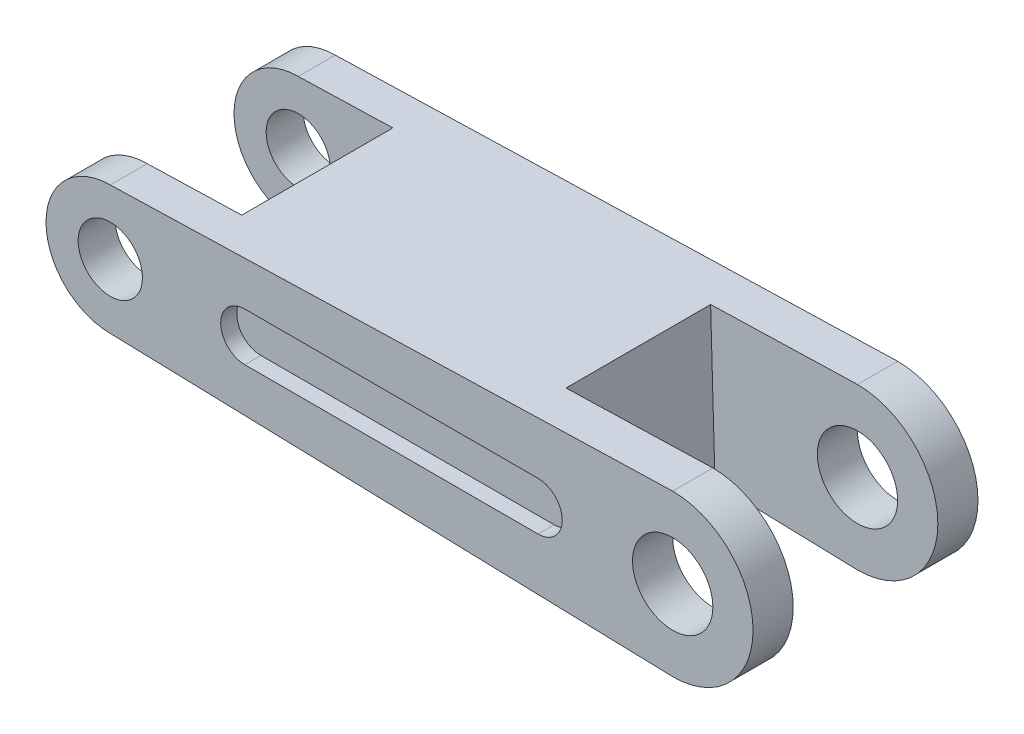
ISO-10303-21;
HEADER;
FILE_DESCRIPTION(('STEP AP214'),'2;1');
FILE_NAME('part.step','',(''),(''),'','','');
FILE_SCHEMA(('AUTOMOTIVE_DESIGN { 1 0 10303 214 1 1 1 1 }'));
ENDSEC;
DATA;
#1=APPLICATION_CONTEXT('core data for automotive mechanical design processes');
#2=APPLICATION_PROTOCOL_DEFINITION('international standard','automotive_design',2000,#1);
#3=PRODUCT_CONTEXT('',#1,'mechanical');
#4=PRODUCT('Part','Part','',(#3));
#5=PRODUCT_RELATED_PRODUCT_CATEGORY('part','',(#4));
#6=PRODUCT_DEFINITION_FORMATION('','',#4);
#7=PRODUCT_DEFINITION_CONTEXT('part definition',#1,'design');
#8=PRODUCT_DEFINITION('design','',#6,#7);
#9=PRODUCT_DEFINITION_SHAPE('','',#8);
#10=(LENGTH_UNIT() NAMED_UNIT(*) SI_UNIT(.MILLI.,.METRE.));
#11=(NAMED_UNIT(*) PLANE_ANGLE_UNIT() SI_UNIT($,.RADIAN.));
#12=(NAMED_UNIT(*) SI_UNIT($,.STERADIAN.) SOLID_ANGLE_UNIT());
#13=UNCERTAINTY_MEASURE_WITH_UNIT(LENGTH_MEASURE(1.E-05),#10,'distance_accuracy_value','');
#14=(GEOMETRIC_REPRESENTATION_CONTEXT(3) GLOBAL_UNCERTAINTY_ASSIGNED_CONTEXT((#13)) GLOBAL_UNIT_ASSIGNED_CONTEXT((#10,
#11,#12)) REPRESENTATION_CONTEXT('',''));
#15=CARTESIAN_POINT('',(0.,0.,0.));
#16=DIRECTION('',(0.,0.,1.));
#17=DIRECTION('',(1.,0.,0.));
#18=AXIS2_PLACEMENT_3D('',#15,#16,#17);
#19=CARTESIAN_POINT('',(0.,0.,-70.));
#20=DIRECTION('',(0.,0.,1.));
#21=DIRECTION('',(1.,0.,0.));
#22=AXIS2_PLACEMENT_3D('',#19,#20,#21);
#23=PLANE('',#22);
#24=DIRECTION('',(0.999592086460695,-0.0285597738988768,0.));
#25=VECTOR('',#24,1.);
#26=CARTESIAN_POINT('',(-1.28466557911907,-44.963295269168,-70.));
#27=LINE('',#26,#25);
#28=CARTESIAN_POINT('',(-175.,-40.,-70.));
#29=VERTEX_POINT('',#28);
#30=CARTESIAN_POINT('',(175.,-49.9999999999999,-70.));
#31=VERTEX_POINT('',#30);
#32=EDGE_CURVE('E384',#29,#31,#27,.T.);
#33=ORIENTED_EDGE('',*,*,#32,.F.);
#34=CARTESIAN_POINT('',(-175.,0.,-70.));
#35=DIRECTION('',(0.,0.,1.));
#36=DIRECTION('',(1.,0.,0.));
#37=AXIS2_PLACEMENT_3D('',#34,#35,#36);
#38=CIRCLE('',#37,40.);
#39=CARTESIAN_POINT('',(-175.,40.,-70.));
#40=VERTEX_POINT('',#39);
#41=EDGE_CURVE('E358',#40,#29,#38,.T.);
#42=ORIENTED_EDGE('',*,*,#41,.F.);
#43=DIRECTION('',(0.999592086460695,0.0285597738988771,0.));
#44=VECTOR('',#43,1.);
#45=CARTESIAN_POINT('',(-1.28466557911909,44.963295269168,-70.));
#46=LINE('',#45,#44);
#47=CARTESIAN_POINT('',(175.,50.,-70.));
#48=VERTEX_POINT('',#47);
#49=EDGE_CURVE('E392',#40,#48,#46,.T.);
#50=ORIENTED_EDGE('',*,*,#49,.T.);
#51=CARTESIAN_POINT('',(175.,0.,-70.));
#52=DIRECTION('',(0.,0.,1.));
#53=DIRECTION('',(1.,0.,0.));
#54=AXIS2_PLACEMENT_3D('',#51,#52,#53);
#55=CIRCLE('',#54,50.);
#56=EDGE_CURVE('E388',#31,#48,#55,.T.);
#57=ORIENTED_EDGE('',*,*,#56,.F.);
#58=EDGE_LOOP('',(#33,#42,#50,#57));
#59=FACE_BOUND('',#58,.T.);
#60=CARTESIAN_POINT('',(-175.,0.,-70.));
#61=DIRECTION('',(0.,0.,1.));
#62=DIRECTION('',(1.,0.,0.));
#63=AXIS2_PLACEMENT_3D('',#60,#61,#62);
#64=CIRCLE('',#63,20.);
#65=CARTESIAN_POINT('',(-155.,0.,-70.));
#66=VERTEX_POINT('',#65);
#67=EDGE_CURVE('E380',#66,#66,#64,.T.);
#68=ORIENTED_EDGE('',*,*,#67,.T.);
#69=EDGE_LOOP('',(#68));
#70=FACE_BOUND('',#69,.T.);
#71=CARTESIAN_POINT('',(175.,0.,-70.));
#72=DIRECTION('',(0.,0.,1.));
#73=DIRECTION('',(1.,0.,0.));
#74=AXIS2_PLACEMENT_3D('',#71,#72,#73);
#75=CIRCLE('',#74,25.);
#76=CARTESIAN_POINT('',(200.,0.,-70.));
#77=VERTEX_POINT('',#76);
#78=EDGE_CURVE('E352',#77,#77,#75,.T.);
#79=ORIENTED_EDGE('',*,*,#78,.T.);
#80=EDGE_LOOP('',(#79));
#81=FACE_BOUND('',#80,.T.);
#82=CARTESIAN_POINT('',(-91.28113722148,0.,-70.));
#83=DIRECTION('',(0.,0.,1.));
#84=DIRECTION('',(1.,0.,0.));
#85=AXIS2_PLACEMENT_3D('',#82,#83,#84);
#86=CIRCLE('',#85,15.);
#87=CARTESIAN_POINT('',(-91.28113722148,15.,-70.));
#88=VERTEX_POINT('',#87);
#89=CARTESIAN_POINT('',(-91.28113722148,-15.,-70.));
#90=VERTEX_POINT('',#89);
#91=EDGE_CURVE('E63',#88,#90,#86,.T.);
#92=ORIENTED_EDGE('',*,*,#91,.T.);
#93=DIRECTION('',(1.,0.,0.));
#94=VECTOR('',#93,1.);
#95=CARTESIAN_POINT('',(-91.28113722148,-15.,-70.));
#96=LINE('',#95,#94);
#97=CARTESIAN_POINT('',(91.28113722148,-15.,-70.));
#98=VERTEX_POINT('',#97);
#99=EDGE_CURVE('E207',#90,#98,#96,.T.);
#100=ORIENTED_EDGE('',*,*,#99,.T.);
#101=CARTESIAN_POINT('',(91.28113722148,0.,-70.));
#102=DIRECTION('',(0.,0.,1.));
#103=DIRECTION('',(1.,0.,0.));
#104=AXIS2_PLACEMENT_3D('',#101,#102,#103);
#105=CIRCLE('',#104,15.);
#106=CARTESIAN_POINT('',(91.28113722148,15.,-70.));
#107=VERTEX_POINT('',#106);
#108=EDGE_CURVE('E211',#98,#107,#105,.T.);
#109=ORIENTED_EDGE('',*,*,#108,.T.);
#110=DIRECTION('',(-1.,0.,0.));
#111=VECTOR('',#110,1.);
#112=CARTESIAN_POINT('',(-91.28113722148,15.,-70.));
#113=LINE('',#112,#111);
#114=EDGE_CURVE('E220',#107,#88,#113,.T.);
#115=ORIENTED_EDGE('',*,*,#114,.T.);
#116=EDGE_LOOP('',(#92,#100,#109,#115));
#117=FACE_BOUND('',#116,.T.);
#118=ADVANCED_FACE('F45',(#59,#70,#81,#117),#23,.F.);
#119=CARTESIAN_POINT('',(-175.,0.,70.));
#120=DIRECTION('',(0.,0.,-1.));
#121=DIRECTION('',(-1.,0.,0.));
#122=AXIS2_PLACEMENT_3D('',#119,#120,#121);
#123=CYLINDRICAL_SURFACE('',#122,40.);
#124=DIRECTION('',(0.,0.,-1.));
#125=VECTOR('',#124,1.);
#126=CARTESIAN_POINT('',(-175.,40.,70.));
#127=LINE('',#126,#125);
#128=CARTESIAN_POINT('',(-175.,40.,70.));
#129=VERTEX_POINT('',#128);
#130=CARTESIAN_POINT('',(-175.000000000001,40.,47.));
#131=VERTEX_POINT('',#130);
#132=EDGE_CURVE('E404',#129,#131,#127,.T.);
#133=ORIENTED_EDGE('',*,*,#132,.T.);
#134=CARTESIAN_POINT('',(-175.,0.,47.));
#135=DIRECTION('',(0.,0.,1.));
#136=DIRECTION('',(1.,0.,0.));
#137=AXIS2_PLACEMENT_3D('',#134,#135,#136);
#138=CIRCLE('',#137,40.);
#139=CARTESIAN_POINT('',(-175.,-40.,47.));
#140=VERTEX_POINT('',#139);
#141=EDGE_CURVE('E11',#131,#140,#138,.T.);
#142=ORIENTED_EDGE('',*,*,#141,.T.);
#143=DIRECTION('',(0.,0.,-1.));
#144=VECTOR('',#143,1.);
#145=CARTESIAN_POINT('',(-175.,-40.,70.));
#146=LINE('',#145,#144);
#147=CARTESIAN_POINT('',(-175.,-40.,70.));
#148=VERTEX_POINT('',#147);
#149=EDGE_CURVE('E399',#148,#140,#146,.T.);
#150=ORIENTED_EDGE('',*,*,#149,.F.);
#151=CARTESIAN_POINT('',(-175.,0.,70.));
#152=DIRECTION('',(0.,0.,1.));
#153=DIRECTION('',(1.,0.,0.));
#154=AXIS2_PLACEMENT_3D('',#151,#152,#153);
#155=CIRCLE('',#154,40.);
#156=EDGE_CURVE('E373',#129,#148,#155,.T.);
#157=ORIENTED_EDGE('',*,*,#156,.F.);
#158=EDGE_LOOP('',(#133,#142,#150,#157));
#159=FACE_BOUND('',#158,.T.);
#160=ADVANCED_FACE('F457',(#159),#123,.T.);
#161=CARTESIAN_POINT('',(175.,0.,70.));
#162=DIRECTION('',(0.,0.,-1.));
#163=DIRECTION('',(-1.,0.,0.));
#164=AXIS2_PLACEMENT_3D('',#161,#162,#163);
#165=CYLINDRICAL_SURFACE('',#164,50.);
#166=DIRECTION('',(0.,0.,-1.));
#167=VECTOR('',#166,1.);
#168=CARTESIAN_POINT('',(175.,50.,70.));
#169=LINE('',#168,#167);
#170=CARTESIAN_POINT('',(175.,50.,-45.));
#171=VERTEX_POINT('',#170);
#172=EDGE_CURVE('E408',#171,#48,#169,.T.);
#173=ORIENTED_EDGE('',*,*,#172,.F.);
#174=CARTESIAN_POINT('',(175.,0.,-45.));
#175=DIRECTION('',(0.,0.,-1.));
#176=DIRECTION('',(-1.,0.,0.));
#177=AXIS2_PLACEMENT_3D('',#174,#175,#176);
#178=CIRCLE('',#177,50.);
#179=CARTESIAN_POINT('',(175.,-49.9999999999999,-45.));
#180=VERTEX_POINT('',#179);
#181=EDGE_CURVE('E336',#171,#180,#178,.T.);
#182=ORIENTED_EDGE('',*,*,#181,.T.);
#183=DIRECTION('',(0.,0.,-1.));
#184=VECTOR('',#183,1.);
#185=CARTESIAN_POINT('',(175.,-49.9999999999999,70.));
#186=LINE('',#185,#184);
#187=EDGE_CURVE('E413',#180,#31,#186,.T.);
#188=ORIENTED_EDGE('',*,*,#187,.T.);
#189=ORIENTED_EDGE('',*,*,#56,.T.);
#190=EDGE_LOOP('',(#173,#182,#188,#189));
#191=FACE_BOUND('',#190,.T.);
#192=ADVANCED_FACE('F549',(#191),#165,.T.);
#193=CARTESIAN_POINT('',(-175.,0.,70.));
#194=DIRECTION('',(0.,0.,-1.));
#195=DIRECTION('',(-1.,0.,0.));
#196=AXIS2_PLACEMENT_3D('',#193,#194,#195);
#197=CYLINDRICAL_SURFACE('',#196,20.);
#198=CARTESIAN_POINT('',(-175.,0.,47.));
#199=DIRECTION('',(0.,0.,1.));
#200=DIRECTION('',(1.,0.,0.));
#201=AXIS2_PLACEMENT_3D('',#198,#199,#200);
#202=CIRCLE('',#201,20.);
#203=CARTESIAN_POINT('',(-155.,0.,47.));
#204=VERTEX_POINT('',#203);
#205=EDGE_CURVE('E324',#204,#204,#202,.T.);
#206=ORIENTED_EDGE('',*,*,#205,.F.);
#207=EDGE_LOOP('',(#206));
#208=FACE_BOUND('',#207,.T.);
#209=CARTESIAN_POINT('',(-175.,0.,70.));
#210=DIRECTION('',(0.,0.,1.));
#211=DIRECTION('',(1.,0.,0.));
#212=AXIS2_PLACEMENT_3D('',#209,#210,#211);
#213=CIRCLE('',#212,20.);
#214=CARTESIAN_POINT('',(-155.,0.,70.));
#215=VERTEX_POINT('',#214);
#216=EDGE_CURVE('E357',#215,#215,#213,.T.);
#217=ORIENTED_EDGE('',*,*,#216,.T.);
#218=EDGE_LOOP('',(#217));
#219=FACE_BOUND('',#218,.T.);
#220=ADVANCED_FACE('F484',(#208,#219),#197,.F.);
#221=CARTESIAN_POINT('',(175.,0.,70.));
#222=DIRECTION('',(0.,0.,-1.));
#223=DIRECTION('',(-1.,0.,0.));
#224=AXIS2_PLACEMENT_3D('',#221,#222,#223);
#225=CYLINDRICAL_SURFACE('',#224,25.);
#226=CARTESIAN_POINT('',(175.,0.,-45.));
#227=DIRECTION('',(0.,0.,-1.));
#228=DIRECTION('',(-1.,0.,0.));
#229=AXIS2_PLACEMENT_3D('',#226,#227,#228);
#230=CIRCLE('',#229,25.);
#231=CARTESIAN_POINT('',(150.,0.,-45.));
#232=VERTEX_POINT('',#231);
#233=EDGE_CURVE('E49',#232,#232,#230,.T.);
#234=ORIENTED_EDGE('',*,*,#233,.F.);
#235=EDGE_LOOP('',(#234));
#236=FACE_BOUND('',#235,.T.);
#237=ORIENTED_EDGE('',*,*,#78,.F.);
#238=EDGE_LOOP('',(#237));
#239=FACE_BOUND('',#238,.T.);
#240=ADVANCED_FACE('F430',(#236,#239),#225,.F.);
#241=CARTESIAN_POINT('',(-1.28466557911907,-44.963295269168,70.));
#242=DIRECTION('',(0.0285597738988768,0.999592086460695,0.));
#243=DIRECTION('',(-0.999592086460695,0.0285597738988768,0.));
#244=AXIS2_PLACEMENT_3D('',#241,#242,#243);
#245=PLANE('',#244);
#246=ORIENTED_EDGE('',*,*,#149,.T.);
#247=DIRECTION('',(0.999592086460695,-0.0285597738988768,0.));
#248=VECTOR('',#247,1.);
#249=CARTESIAN_POINT('',(-1.28466557911908,-44.963295269168,47.));
#250=LINE('',#249,#248);
#251=CARTESIAN_POINT('',(-113.782684738522,-41.7490661503279,47.));
#252=VERTEX_POINT('',#251);
#253=EDGE_CURVE('E320',#140,#252,#250,.T.);
#254=ORIENTED_EDGE('',*,*,#253,.T.);
#255=DIRECTION('',(0.,0.,-1.));
#256=VECTOR('',#255,1.);
#257=CARTESIAN_POINT('',(-113.782684738522,-41.7490661503279,70.));
#258=LINE('',#257,#256);
#259=CARTESIAN_POINT('',(-113.782684738522,-41.7490661503279,-47.0000000000001));
#260=VERTEX_POINT('',#259);
#261=EDGE_CURVE('E348',#252,#260,#258,.T.);
#262=ORIENTED_EDGE('',*,*,#261,.T.);
#263=DIRECTION('',(-0.999592086460695,0.0285597738988768,0.));
#264=VECTOR('',#263,1.);
#265=CARTESIAN_POINT('',(-1.28466557911909,-44.963295269168,-47.0000000000001));
#266=LINE('',#265,#264);
#267=CARTESIAN_POINT('',(-175.,-40.,-47.0000000000001));
#268=VERTEX_POINT('',#267);
#269=EDGE_CURVE('E294',#260,#268,#266,.T.);
#270=ORIENTED_EDGE('',*,*,#269,.T.);
#271=EDGE_CURVE('E376',#268,#29,#146,.T.);
#272=ORIENTED_EDGE('',*,*,#271,.T.);
#273=ORIENTED_EDGE('',*,*,#32,.T.);
#274=ORIENTED_EDGE('',*,*,#187,.F.);
#275=DIRECTION('',(-0.999592086460695,0.0285597738988768,0.));
#276=VECTOR('',#275,1.);
#277=CARTESIAN_POINT('',(-1.28466557911908,-44.963295269168,-45.));
#278=LINE('',#277,#276);
#279=CARTESIAN_POINT('',(86.3194519443847,-47.4662700555538,-45.));
#280=VERTEX_POINT('',#279);
#281=EDGE_CURVE('E340',#180,#280,#278,.T.);
#282=ORIENTED_EDGE('',*,*,#281,.T.);
#283=DIRECTION('',(0.,0.,1.));
#284=VECTOR('',#283,1.);
#285=CARTESIAN_POINT('',(86.3194519443847,-47.4662700555538,70.));
#286=LINE('',#285,#284);
#287=CARTESIAN_POINT('',(86.3194519443847,-47.4662700555538,45.));
#288=VERTEX_POINT('',#287);
#289=EDGE_CURVE('E344',#280,#288,#286,.T.);
#290=ORIENTED_EDGE('',*,*,#289,.T.);
#291=DIRECTION('',(0.999592086460695,-0.0285597738988768,0.));
#292=VECTOR('',#291,1.);
#293=CARTESIAN_POINT('',(-1.28466557911907,-44.963295269168,45.));
#294=LINE('',#293,#292);
#295=CARTESIAN_POINT('',(175.,-49.9999999999999,45.));
#296=VERTEX_POINT('',#295);
#297=EDGE_CURVE('E332',#288,#296,#294,.T.);
#298=ORIENTED_EDGE('',*,*,#297,.T.);
#299=CARTESIAN_POINT('',(175.,-49.9999999999999,70.));
#300=VERTEX_POINT('',#299);
#301=EDGE_CURVE('E414',#300,#296,#186,.T.);
#302=ORIENTED_EDGE('',*,*,#301,.F.);
#303=DIRECTION('',(0.999592086460695,-0.0285597738988768,0.));
#304=VECTOR('',#303,1.);
#305=CARTESIAN_POINT('',(-1.28466557911907,-44.963295269168,70.));
#306=LINE('',#305,#304);
#307=EDGE_CURVE('E362',#148,#300,#306,.T.);
#308=ORIENTED_EDGE('',*,*,#307,.F.);
#309=EDGE_LOOP('',(#246,#254,#262,#270,#272,#273,#274,#282,#290,#298,#302,#308));
#310=FACE_BOUND('',#309,.T.);
#311=ADVANCED_FACE('F448',(#310),#245,.F.);
#312=CARTESIAN_POINT('',(175.,0.,45.));
#313=DIRECTION('',(0.,0.,1.));
#314=DIRECTION('',(1.,0.,0.));
#315=AXIS2_PLACEMENT_3D('',#312,#313,#314);
#316=CIRCLE('',#315,50.);
#317=CARTESIAN_POINT('',(175.,50.,45.));
#318=VERTEX_POINT('',#317);
#319=EDGE_CURVE('E329',#296,#318,#316,.T.);
#320=ORIENTED_EDGE('',*,*,#319,.T.);
#321=CARTESIAN_POINT('',(175.,50.,70.));
#322=VERTEX_POINT('',#321);
#323=EDGE_CURVE('E409',#322,#318,#169,.T.);
#324=ORIENTED_EDGE('',*,*,#323,.F.);
#325=CARTESIAN_POINT('',(175.,0.,70.));
#326=DIRECTION('',(0.,0.,1.));
#327=DIRECTION('',(1.,0.,0.));
#328=AXIS2_PLACEMENT_3D('',#325,#326,#327);
#329=CIRCLE('',#328,50.);
#330=EDGE_CURVE('E366',#300,#322,#329,.T.);
#331=ORIENTED_EDGE('',*,*,#330,.F.);
#332=ORIENTED_EDGE('',*,*,#301,.T.);
#333=EDGE_LOOP('',(#320,#324,#331,#332));
#334=FACE_BOUND('',#333,.T.);
#335=ADVANCED_FACE('F450',(#334),#165,.T.);
#336=CARTESIAN_POINT('',(-1.28466557911909,44.963295269168,70.));
#337=DIRECTION('',(-0.0285597738988771,0.999592086460695,0.));
#338=DIRECTION('',(-0.999592086460695,-0.0285597738988771,0.));
#339=AXIS2_PLACEMENT_3D('',#336,#337,#338);
#340=PLANE('',#339);
#341=DIRECTION('',(0.999592086460695,0.0285597738988771,0.));
#342=VECTOR('',#341,1.);
#343=CARTESIAN_POINT('',(-116.166399771575,41.6809600065264,47.));
#344=LINE('',#343,#342);
#345=CARTESIAN_POINT('',(-116.166399771575,41.6809600065264,47.));
#346=VERTEX_POINT('',#345);
#347=EDGE_CURVE('E286',#131,#346,#344,.T.);
#348=ORIENTED_EDGE('',*,*,#347,.F.);
#349=ORIENTED_EDGE('',*,*,#132,.F.);
#350=DIRECTION('',(0.999592086460695,0.0285597738988771,0.));
#351=VECTOR('',#350,1.);
#352=CARTESIAN_POINT('',(-1.28466557911909,44.963295269168,70.));
#353=LINE('',#352,#351);
#354=EDGE_CURVE('E369',#129,#322,#353,.T.);
#355=ORIENTED_EDGE('',*,*,#354,.T.);
#356=ORIENTED_EDGE('',*,*,#323,.T.);
#357=DIRECTION('',(0.999592086460695,0.0285597738988771,0.));
#358=VECTOR('',#357,1.);
#359=CARTESIAN_POINT('',(83.6093060195162,47.3888373148434,45.));
#360=LINE('',#359,#358);
#361=CARTESIAN_POINT('',(83.6093060195162,47.3888373148434,45.));
#362=VERTEX_POINT('',#361);
#363=EDGE_CURVE('E307',#362,#318,#360,.T.);
#364=ORIENTED_EDGE('',*,*,#363,.F.);
#365=DIRECTION('',(0.,0.,1.));
#366=VECTOR('',#365,1.);
#367=CARTESIAN_POINT('',(83.6093060195162,47.3888373148434,-45.));
#368=LINE('',#367,#366);
#369=CARTESIAN_POINT('',(83.6093060195162,47.3888373148434,-45.));
#370=VERTEX_POINT('',#369);
#371=EDGE_CURVE('E282',#370,#362,#368,.T.);
#372=ORIENTED_EDGE('',*,*,#371,.F.);
#373=DIRECTION('',(-0.999592086460695,-0.0285597738988771,0.));
#374=VECTOR('',#373,1.);
#375=CARTESIAN_POINT('',(83.6093060195162,47.3888373148434,-45.));
#376=LINE('',#375,#374);
#377=EDGE_CURVE('E301',#171,#370,#376,.T.);
#378=ORIENTED_EDGE('',*,*,#377,.F.);
#379=ORIENTED_EDGE('',*,*,#172,.T.);
#380=ORIENTED_EDGE('',*,*,#49,.F.);
#381=CARTESIAN_POINT('',(-175.,40.,-47.0000000000001));
#382=VERTEX_POINT('',#381);
#383=EDGE_CURVE('E403',#382,#40,#127,.T.);
#384=ORIENTED_EDGE('',*,*,#383,.F.);
#385=DIRECTION('',(-0.999592086460695,-0.0285597738988771,0.));
#386=VECTOR('',#385,1.);
#387=CARTESIAN_POINT('',(-116.166399771575,41.6809600065264,-47.0000000000001));
#388=LINE('',#387,#386);
#389=CARTESIAN_POINT('',(-116.166399771575,41.6809600065264,-47.0000000000001));
#390=VERTEX_POINT('',#389);
#391=EDGE_CURVE('E281',#390,#382,#388,.T.);
#392=ORIENTED_EDGE('',*,*,#391,.F.);
#393=DIRECTION('',(0.,0.,-1.));
#394=VECTOR('',#393,1.);
#395=CARTESIAN_POINT('',(-116.166399771575,41.6809600065264,-47.0000000000001));
#396=LINE('',#395,#394);
#397=EDGE_CURVE('E277',#346,#390,#396,.T.);
#398=ORIENTED_EDGE('',*,*,#397,.F.);
#399=EDGE_LOOP('',(#348,#349,#355,#356,#364,#372,#378,#379,#380,#384,#392,#398));
#400=FACE_BOUND('',#399,.T.);
#401=ADVANCED_FACE('F454',(#400),#340,.T.);
#402=CARTESIAN_POINT('',(-175.,0.,-47.0000000000001));
#403=DIRECTION('',(0.,0.,-1.));
#404=DIRECTION('',(-1.,0.,0.));
#405=AXIS2_PLACEMENT_3D('',#402,#403,#404);
#406=CIRCLE('',#405,20.);
#407=CARTESIAN_POINT('',(-195.,0.,-47.0000000000001));
#408=VERTEX_POINT('',#407);
#409=EDGE_CURVE('E316',#408,#408,#406,.T.);
#410=ORIENTED_EDGE('',*,*,#409,.F.);
#411=EDGE_LOOP('',(#410));
#412=FACE_BOUND('',#411,.T.);
#413=ORIENTED_EDGE('',*,*,#67,.F.);
#414=EDGE_LOOP('',(#413));
#415=FACE_BOUND('',#414,.T.);
#416=ADVANCED_FACE('F429',(#412,#415),#197,.F.);
#417=CARTESIAN_POINT('',(175.,0.,45.));
#418=DIRECTION('',(0.,0.,1.));
#419=DIRECTION('',(1.,0.,0.));
#420=AXIS2_PLACEMENT_3D('',#417,#418,#419);
#421=CIRCLE('',#420,25.);
#422=CARTESIAN_POINT('',(200.,0.,45.));
#423=VERTEX_POINT('',#422);
#424=EDGE_CURVE('E328',#423,#423,#421,.T.);
#425=ORIENTED_EDGE('',*,*,#424,.F.);
#426=EDGE_LOOP('',(#425));
#427=FACE_BOUND('',#426,.T.);
#428=CARTESIAN_POINT('',(175.,0.,70.));
#429=DIRECTION('',(0.,0.,1.));
#430=DIRECTION('',(1.,0.,0.));
#431=AXIS2_PLACEMENT_3D('',#428,#429,#430);
#432=CIRCLE('',#431,25.);
#433=CARTESIAN_POINT('',(200.,0.,70.));
#434=VERTEX_POINT('',#433);
#435=EDGE_CURVE('E353',#434,#434,#432,.T.);
#436=ORIENTED_EDGE('',*,*,#435,.T.);
#437=EDGE_LOOP('',(#436));
#438=FACE_BOUND('',#437,.T.);
#439=ADVANCED_FACE('F47',(#427,#438),#225,.F.);
#440=CARTESIAN_POINT('',(-175.,0.,-47.0000000000001));
#441=DIRECTION('',(0.,0.,-1.));
#442=DIRECTION('',(-1.,0.,0.));
#443=AXIS2_PLACEMENT_3D('',#440,#441,#442);
#444=CIRCLE('',#443,40.);
#445=EDGE_CURVE('E55',#268,#382,#444,.T.);
#446=ORIENTED_EDGE('',*,*,#445,.T.);
#447=ORIENTED_EDGE('',*,*,#383,.T.);
#448=ORIENTED_EDGE('',*,*,#41,.T.);
#449=ORIENTED_EDGE('',*,*,#271,.F.);
#450=EDGE_LOOP('',(#446,#447,#448,#449));
#451=FACE_BOUND('',#450,.T.);
#452=ADVANCED_FACE('F428',(#451),#123,.T.);
#453=CARTESIAN_POINT('',(0.,0.,70.));
#454=DIRECTION('',(0.,0.,1.));
#455=DIRECTION('',(1.,0.,0.));
#456=AXIS2_PLACEMENT_3D('',#453,#454,#455);
#457=PLANE('',#456);
#458=CARTESIAN_POINT('',(-91.28113722148,0.,70.));
#459=DIRECTION('',(0.,0.,1.));
#460=DIRECTION('',(1.,0.,0.));
#461=AXIS2_PLACEMENT_3D('',#458,#459,#460);
#462=CIRCLE('',#461,15.);
#463=CARTESIAN_POINT('',(-91.28113722148,15.,70.));
#464=VERTEX_POINT('',#463);
#465=CARTESIAN_POINT('',(-91.28113722148,-15.,70.));
#466=VERTEX_POINT('',#465);
#467=EDGE_CURVE('E71',#464,#466,#462,.T.);
#468=ORIENTED_EDGE('',*,*,#467,.F.);
#469=DIRECTION('',(-1.,0.,0.));
#470=VECTOR('',#469,1.);
#471=CARTESIAN_POINT('',(-91.28113722148,15.,70.));
#472=LINE('',#471,#470);
#473=CARTESIAN_POINT('',(91.28113722148,15.,70.));
#474=VERTEX_POINT('',#473);
#475=EDGE_CURVE('E239',#474,#464,#472,.T.);
#476=ORIENTED_EDGE('',*,*,#475,.F.);
#477=CARTESIAN_POINT('',(91.28113722148,0.,70.));
#478=DIRECTION('',(0.,0.,1.));
#479=DIRECTION('',(1.,0.,0.));
#480=AXIS2_PLACEMENT_3D('',#477,#478,#479);
#481=CIRCLE('',#480,15.);
#482=CARTESIAN_POINT('',(91.28113722148,-15.,70.));
#483=VERTEX_POINT('',#482);
#484=EDGE_CURVE('E258',#483,#474,#481,.T.);
#485=ORIENTED_EDGE('',*,*,#484,.F.);
#486=DIRECTION('',(1.,0.,0.));
#487=VECTOR('',#486,1.);
#488=CARTESIAN_POINT('',(-91.28113722148,-15.,70.));
#489=LINE('',#488,#487);
#490=EDGE_CURVE('E254',#466,#483,#489,.T.);
#491=ORIENTED_EDGE('',*,*,#490,.F.);
#492=EDGE_LOOP('',(#468,#476,#485,#491));
#493=FACE_BOUND('',#492,.T.);
#494=ORIENTED_EDGE('',*,*,#435,.F.);
#495=EDGE_LOOP('',(#494));
#496=FACE_BOUND('',#495,.T.);
#497=ORIENTED_EDGE('',*,*,#216,.F.);
#498=EDGE_LOOP('',(#497));
#499=FACE_BOUND('',#498,.T.);
#500=ORIENTED_EDGE('',*,*,#307,.T.);
#501=ORIENTED_EDGE('',*,*,#330,.T.);
#502=ORIENTED_EDGE('',*,*,#354,.F.);
#503=ORIENTED_EDGE('',*,*,#156,.T.);
#504=EDGE_LOOP('',(#500,#501,#502,#503));
#505=FACE_BOUND('',#504,.T.);
#506=ADVANCED_FACE('F433',(#493,#496,#499,#505),#457,.T.);
#507=CARTESIAN_POINT('',(-113.270804339275,-59.6648801239793,-47.0000000000001));
#508=DIRECTION('',(0.999592086460695,0.0285597738988771,0.));
#509=DIRECTION('',(-0.0285597738988771,0.999592086460695,0.));
#510=AXIS2_PLACEMENT_3D('',#507,#508,#509);
#511=PLANE('',#510);
#512=DIRECTION('',(-0.0285597738988771,0.999592086460695,0.));
#513=VECTOR('',#512,1.);
#514=CARTESIAN_POINT('',(-113.270804339275,-59.6648801239793,47.));
#515=LINE('',#514,#513);
#516=EDGE_CURVE('E291',#252,#346,#515,.T.);
#517=ORIENTED_EDGE('',*,*,#516,.T.);
#518=ORIENTED_EDGE('',*,*,#397,.T.);
#519=DIRECTION('',(-0.0285597738988771,0.999592086460695,0.));
#520=VECTOR('',#519,1.);
#521=CARTESIAN_POINT('',(-113.270804339275,-59.6648801239793,-47.0000000000001));
#522=LINE('',#521,#520);
#523=EDGE_CURVE('E290',#260,#390,#522,.T.);
#524=ORIENTED_EDGE('',*,*,#523,.F.);
#525=ORIENTED_EDGE('',*,*,#261,.F.);
#526=EDGE_LOOP('',(#517,#518,#524,#525));
#527=FACE_BOUND('',#526,.T.);
#528=ADVANCED_FACE('F436',(#527),#511,.F.);
#529=CARTESIAN_POINT('',(-113.270804339275,-59.6648801239793,47.));
#530=DIRECTION('',(0.,0.,1.));
#531=DIRECTION('',(1.,0.,0.));
#532=AXIS2_PLACEMENT_3D('',#529,#530,#531);
#533=PLANE('',#532);
#534=ORIENTED_EDGE('',*,*,#205,.T.);
#535=EDGE_LOOP('',(#534));
#536=FACE_BOUND('',#535,.T.);
#537=ORIENTED_EDGE('',*,*,#141,.F.);
#538=ORIENTED_EDGE('',*,*,#347,.T.);
#539=ORIENTED_EDGE('',*,*,#516,.F.);
#540=ORIENTED_EDGE('',*,*,#253,.F.);
#541=EDGE_LOOP('',(#537,#538,#539,#540));
#542=FACE_BOUND('',#541,.T.);
#543=ADVANCED_FACE('F461',(#536,#542),#533,.F.);
#544=CARTESIAN_POINT('',(-113.270804339275,-59.6648801239793,-47.0000000000001));
#545=DIRECTION('',(0.,0.,-1.));
#546=DIRECTION('',(-1.,0.,0.));
#547=AXIS2_PLACEMENT_3D('',#544,#545,#546);
#548=PLANE('',#547);
#549=ORIENTED_EDGE('',*,*,#391,.T.);
#550=ORIENTED_EDGE('',*,*,#445,.F.);
#551=ORIENTED_EDGE('',*,*,#269,.F.);
#552=ORIENTED_EDGE('',*,*,#523,.T.);
#553=EDGE_LOOP('',(#549,#550,#551,#552));
#554=FACE_BOUND('',#553,.T.);
#555=ORIENTED_EDGE('',*,*,#409,.T.);
#556=EDGE_LOOP('',(#555));
#557=FACE_BOUND('',#556,.T.);
#558=ADVANCED_FACE('F466',(#554,#557),#548,.F.);
#559=CARTESIAN_POINT('',(86.5049014518164,-53.9570028156624,-45.));
#560=DIRECTION('',(-0.999592086460695,-0.0285597738988771,0.));
#561=DIRECTION('',(0.0285597738988771,-0.999592086460695,0.));
#562=AXIS2_PLACEMENT_3D('',#559,#560,#561);
#563=PLANE('',#562);
#564=DIRECTION('',(-0.0285597738988771,0.999592086460695,0.));
#565=VECTOR('',#564,1.);
#566=CARTESIAN_POINT('',(86.5049014518164,-53.9570028156624,-45.));
#567=LINE('',#566,#565);
#568=EDGE_CURVE('E268',#280,#370,#567,.T.);
#569=ORIENTED_EDGE('',*,*,#568,.T.);
#570=ORIENTED_EDGE('',*,*,#371,.T.);
#571=DIRECTION('',(-0.0285597738988771,0.999592086460695,0.));
#572=VECTOR('',#571,1.);
#573=CARTESIAN_POINT('',(86.5049014518164,-53.9570028156624,45.));
#574=LINE('',#573,#572);
#575=EDGE_CURVE('E297',#288,#362,#574,.T.);
#576=ORIENTED_EDGE('',*,*,#575,.F.);
#577=ORIENTED_EDGE('',*,*,#289,.F.);
#578=EDGE_LOOP('',(#569,#570,#576,#577));
#579=FACE_BOUND('',#578,.T.);
#580=ADVANCED_FACE('F533',(#579),#563,.F.);
#581=CARTESIAN_POINT('',(86.5049014518164,-53.9570028156624,-45.));
#582=DIRECTION('',(0.,0.,-1.));
#583=DIRECTION('',(-1.,0.,0.));
#584=AXIS2_PLACEMENT_3D('',#581,#582,#583);
#585=PLANE('',#584);
#586=ORIENTED_EDGE('',*,*,#233,.T.);
#587=EDGE_LOOP('',(#586));
#588=FACE_BOUND('',#587,.T.);
#589=ORIENTED_EDGE('',*,*,#181,.F.);
#590=ORIENTED_EDGE('',*,*,#377,.T.);
#591=ORIENTED_EDGE('',*,*,#568,.F.);
#592=ORIENTED_EDGE('',*,*,#281,.F.);
#593=EDGE_LOOP('',(#589,#590,#591,#592));
#594=FACE_BOUND('',#593,.T.);
#595=ADVANCED_FACE('F479',(#588,#594),#585,.F.);
#596=CARTESIAN_POINT('',(86.5049014518164,-53.9570028156624,45.));
#597=DIRECTION('',(0.,0.,1.));
#598=DIRECTION('',(1.,0.,0.));
#599=AXIS2_PLACEMENT_3D('',#596,#597,#598);
#600=PLANE('',#599);
#601=ORIENTED_EDGE('',*,*,#424,.T.);
#602=EDGE_LOOP('',(#601));
#603=FACE_BOUND('',#602,.T.);
#604=ORIENTED_EDGE('',*,*,#575,.T.);
#605=ORIENTED_EDGE('',*,*,#363,.T.);
#606=ORIENTED_EDGE('',*,*,#319,.F.);
#607=ORIENTED_EDGE('',*,*,#297,.F.);
#608=EDGE_LOOP('',(#604,#605,#606,#607));
#609=FACE_BOUND('',#608,.T.);
#610=ADVANCED_FACE('F423',(#603,#609),#600,.F.);
#611=CARTESIAN_POINT('',(-91.28113722148,0.,60.));
#612=DIRECTION('',(0.,0.,1.));
#613=DIRECTION('',(1.,0.,0.));
#614=AXIS2_PLACEMENT_3D('',#611,#612,#613);
#615=CYLINDRICAL_SURFACE('',#614,15.);
#616=ORIENTED_EDGE('',*,*,#467,.T.);
#617=DIRECTION('',(0.,0.,1.));
#618=VECTOR('',#617,1.);
#619=CARTESIAN_POINT('',(-91.28113722148,-15.,60.));
#620=LINE('',#619,#618);
#621=CARTESIAN_POINT('',(-91.28113722148,-15.,60.));
#622=VERTEX_POINT('',#621);
#623=EDGE_CURVE('E251',#622,#466,#620,.T.);
#624=ORIENTED_EDGE('',*,*,#623,.F.);
#625=CARTESIAN_POINT('',(-91.28113722148,0.,60.));
#626=DIRECTION('',(0.,0.,1.));
#627=DIRECTION('',(1.,0.,0.));
#628=AXIS2_PLACEMENT_3D('',#625,#626,#627);
#629=CIRCLE('',#628,15.);
#630=CARTESIAN_POINT('',(-91.28113722148,15.,60.));
#631=VERTEX_POINT('',#630);
#632=EDGE_CURVE('E234',#631,#622,#629,.T.);
#633=ORIENTED_EDGE('',*,*,#632,.F.);
#634=DIRECTION('',(0.,0.,1.));
#635=VECTOR('',#634,1.);
#636=CARTESIAN_POINT('',(-91.28113722148,15.,60.));
#637=LINE('',#636,#635);
#638=EDGE_CURVE('E265',#631,#464,#637,.T.);
#639=ORIENTED_EDGE('',*,*,#638,.T.);
#640=EDGE_LOOP('',(#616,#624,#633,#639));
#641=FACE_BOUND('',#640,.T.);
#642=ADVANCED_FACE('F518',(#641),#615,.F.);
#643=CARTESIAN_POINT('',(-91.28113722148,15.,60.));
#644=DIRECTION('',(0.,1.,0.));
#645=DIRECTION('',(-1.,0.,0.));
#646=AXIS2_PLACEMENT_3D('',#643,#644,#645);
#647=PLANE('',#646);
#648=ORIENTED_EDGE('',*,*,#475,.T.);
#649=ORIENTED_EDGE('',*,*,#638,.F.);
#650=DIRECTION('',(-1.,0.,0.));
#651=VECTOR('',#650,1.);
#652=CARTESIAN_POINT('',(-91.28113722148,15.,60.));
#653=LINE('',#652,#651);
#654=CARTESIAN_POINT('',(91.28113722148,15.,60.));
#655=VERTEX_POINT('',#654);
#656=EDGE_CURVE('E247',#655,#631,#653,.T.);
#657=ORIENTED_EDGE('',*,*,#656,.F.);
#658=DIRECTION('',(0.,0.,1.));
#659=VECTOR('',#658,1.);
#660=CARTESIAN_POINT('',(91.28113722148,15.,60.));
#661=LINE('',#660,#659);
#662=EDGE_CURVE('E269',#655,#474,#661,.T.);
#663=ORIENTED_EDGE('',*,*,#662,.T.);
#664=EDGE_LOOP('',(#648,#649,#657,#663));
#665=FACE_BOUND('',#664,.T.);
#666=ADVANCED_FACE('F514',(#665),#647,.F.);
#667=CARTESIAN_POINT('',(91.28113722148,0.,60.));
#668=DIRECTION('',(0.,0.,1.));
#669=DIRECTION('',(1.,0.,0.));
#670=AXIS2_PLACEMENT_3D('',#667,#668,#669);
#671=CYLINDRICAL_SURFACE('',#670,15.);
#672=ORIENTED_EDGE('',*,*,#484,.T.);
#673=ORIENTED_EDGE('',*,*,#662,.F.);
#674=CARTESIAN_POINT('',(91.28113722148,0.,60.));
#675=DIRECTION('',(0.,0.,1.));
#676=DIRECTION('',(1.,0.,0.));
#677=AXIS2_PLACEMENT_3D('',#674,#675,#676);
#678=CIRCLE('',#677,15.);
#679=CARTESIAN_POINT('',(91.28113722148,-15.,60.));
#680=VERTEX_POINT('',#679);
#681=EDGE_CURVE('E243',#680,#655,#678,.T.);
#682=ORIENTED_EDGE('',*,*,#681,.F.);
#683=DIRECTION('',(0.,0.,1.));
#684=VECTOR('',#683,1.);
#685=CARTESIAN_POINT('',(91.28113722148,-15.,60.));
#686=LINE('',#685,#684);
#687=EDGE_CURVE('E272',#680,#483,#686,.T.);
#688=ORIENTED_EDGE('',*,*,#687,.T.);
#689=EDGE_LOOP('',(#672,#673,#682,#688));
#690=FACE_BOUND('',#689,.T.);
#691=ADVANCED_FACE('F517',(#690),#671,.F.);
#692=CARTESIAN_POINT('',(-91.28113722148,-15.,60.));
#693=DIRECTION('',(0.,-1.,0.));
#694=DIRECTION('',(1.,0.,0.));
#695=AXIS2_PLACEMENT_3D('',#692,#693,#694);
#696=PLANE('',#695);
#697=ORIENTED_EDGE('',*,*,#490,.T.);
#698=ORIENTED_EDGE('',*,*,#687,.F.);
#699=DIRECTION('',(1.,0.,0.));
#700=VECTOR('',#699,1.);
#701=CARTESIAN_POINT('',(-91.28113722148,-15.,60.));
#702=LINE('',#701,#700);
#703=EDGE_CURVE('E238',#622,#680,#702,.T.);
#704=ORIENTED_EDGE('',*,*,#703,.F.);
#705=ORIENTED_EDGE('',*,*,#623,.T.);
#706=EDGE_LOOP('',(#697,#698,#704,#705));
#707=FACE_BOUND('',#706,.T.);
#708=ADVANCED_FACE('F512',(#707),#696,.F.);
#709=CARTESIAN_POINT('',(-91.28113722148,0.,60.));
#710=DIRECTION('',(0.,0.,1.));
#711=DIRECTION('',(1.,0.,0.));
#712=AXIS2_PLACEMENT_3D('',#709,#710,#711);
#713=PLANE('',#712);
#714=ORIENTED_EDGE('',*,*,#632,.T.);
#715=ORIENTED_EDGE('',*,*,#703,.T.);
#716=ORIENTED_EDGE('',*,*,#681,.T.);
#717=ORIENTED_EDGE('',*,*,#656,.T.);
#718=EDGE_LOOP('',(#714,#715,#716,#717));
#719=FACE_BOUND('',#718,.T.);
#720=ADVANCED_FACE('F504',(#719),#713,.T.);
#721=CARTESIAN_POINT('',(-91.28113722148,0.,-60.));
#722=DIRECTION('',(0.,0.,-1.));
#723=DIRECTION('',(-1.,0.,0.));
#724=AXIS2_PLACEMENT_3D('',#721,#722,#723);
#725=CYLINDRICAL_SURFACE('',#724,15.);
#726=ORIENTED_EDGE('',*,*,#91,.F.);
#727=DIRECTION('',(0.,0.,-1.));
#728=VECTOR('',#727,1.);
#729=CARTESIAN_POINT('',(-91.28113722148,15.,-60.));
#730=LINE('',#729,#728);
#731=CARTESIAN_POINT('',(-91.28113722148,15.,-60.));
#732=VERTEX_POINT('',#731);
#733=EDGE_CURVE('E189',#732,#88,#730,.T.);
#734=ORIENTED_EDGE('',*,*,#733,.F.);
#735=CARTESIAN_POINT('',(-91.28113722148,0.,-60.));
#736=DIRECTION('',(0.,0.,1.));
#737=DIRECTION('',(1.,0.,0.));
#738=AXIS2_PLACEMENT_3D('',#735,#736,#737);
#739=CIRCLE('',#738,15.);
#740=CARTESIAN_POINT('',(-91.28113722148,-15.,-60.));
#741=VERTEX_POINT('',#740);
#742=EDGE_CURVE('E197',#732,#741,#739,.T.);
#743=ORIENTED_EDGE('',*,*,#742,.T.);
#744=DIRECTION('',(0.,0.,-1.));
#745=VECTOR('',#744,1.);
#746=CARTESIAN_POINT('',(-91.28113722148,-15.,-60.));
#747=LINE('',#746,#745);
#748=EDGE_CURVE('E226',#741,#90,#747,.T.);
#749=ORIENTED_EDGE('',*,*,#748,.T.);
#750=EDGE_LOOP('',(#726,#734,#743,#749));
#751=FACE_BOUND('',#750,.T.);
#752=ADVANCED_FACE('F200',(#751),#725,.F.);
#753=CARTESIAN_POINT('',(-91.28113722148,-15.,-60.));
#754=DIRECTION('',(0.,1.,0.));
#755=DIRECTION('',(-1.,0.,0.));
#756=AXIS2_PLACEMENT_3D('',#753,#754,#755);
#757=PLANE('',#756);
#758=ORIENTED_EDGE('',*,*,#99,.F.);
#759=ORIENTED_EDGE('',*,*,#748,.F.);
#760=DIRECTION('',(1.,0.,0.));
#761=VECTOR('',#760,1.);
#762=CARTESIAN_POINT('',(-91.28113722148,-15.,-60.));
#763=LINE('',#762,#761);
#764=CARTESIAN_POINT('',(91.28113722148,-15.,-60.));
#765=VERTEX_POINT('',#764);
#766=EDGE_CURVE('E203',#741,#765,#763,.T.);
#767=ORIENTED_EDGE('',*,*,#766,.T.);
#768=DIRECTION('',(0.,0.,-1.));
#769=VECTOR('',#768,1.);
#770=CARTESIAN_POINT('',(91.28113722148,-15.,-60.));
#771=LINE('',#770,#769);
#772=EDGE_CURVE('E229',#765,#98,#771,.T.);
#773=ORIENTED_EDGE('',*,*,#772,.T.);
#774=EDGE_LOOP('',(#758,#759,#767,#773));
#775=FACE_BOUND('',#774,.T.);
#776=ADVANCED_FACE('F496',(#775),#757,.T.);
#777=CARTESIAN_POINT('',(91.28113722148,0.,-60.));
#778=DIRECTION('',(0.,0.,-1.));
#779=DIRECTION('',(-1.,0.,0.));
#780=AXIS2_PLACEMENT_3D('',#777,#778,#779);
#781=CYLINDRICAL_SURFACE('',#780,15.);
#782=ORIENTED_EDGE('',*,*,#108,.F.);
#783=ORIENTED_EDGE('',*,*,#772,.F.);
#784=CARTESIAN_POINT('',(91.28113722148,0.,-60.));
#785=DIRECTION('',(0.,0.,1.));
#786=DIRECTION('',(1.,0.,0.));
#787=AXIS2_PLACEMENT_3D('',#784,#785,#786);
#788=CIRCLE('',#787,15.);
#789=CARTESIAN_POINT('',(91.28113722148,15.,-60.));
#790=VERTEX_POINT('',#789);
#791=EDGE_CURVE('E196',#765,#790,#788,.T.);
#792=ORIENTED_EDGE('',*,*,#791,.T.);
#793=DIRECTION('',(0.,0.,-1.));
#794=VECTOR('',#793,1.);
#795=CARTESIAN_POINT('',(91.28113722148,15.,-60.));
#796=LINE('',#795,#794);
#797=EDGE_CURVE('E191',#790,#107,#796,.T.);
#798=ORIENTED_EDGE('',*,*,#797,.T.);
#799=EDGE_LOOP('',(#782,#783,#792,#798));
#800=FACE_BOUND('',#799,.T.);
#801=ADVANCED_FACE('F494',(#800),#781,.F.);
#802=CARTESIAN_POINT('',(-91.28113722148,15.,-60.));
#803=DIRECTION('',(0.,-1.,0.));
#804=DIRECTION('',(1.,0.,0.));
#805=AXIS2_PLACEMENT_3D('',#802,#803,#804);
#806=PLANE('',#805);
#807=ORIENTED_EDGE('',*,*,#114,.F.);
#808=ORIENTED_EDGE('',*,*,#797,.F.);
#809=DIRECTION('',(-1.,0.,0.));
#810=VECTOR('',#809,1.);
#811=CARTESIAN_POINT('',(-91.28113722148,15.,-60.));
#812=LINE('',#811,#810);
#813=EDGE_CURVE('E186',#790,#732,#812,.T.);
#814=ORIENTED_EDGE('',*,*,#813,.T.);
#815=ORIENTED_EDGE('',*,*,#733,.T.);
#816=EDGE_LOOP('',(#807,#808,#814,#815));
#817=FACE_BOUND('',#816,.T.);
#818=ADVANCED_FACE('F188',(#817),#806,.T.);
#819=CARTESIAN_POINT('',(-91.28113722148,0.,-60.));
#820=DIRECTION('',(0.,0.,-1.));
#821=DIRECTION('',(1.,0.,0.));
#822=AXIS2_PLACEMENT_3D('',#819,#820,#821);
#823=PLANE('',#822);
#824=ORIENTED_EDGE('',*,*,#742,.F.);
#825=ORIENTED_EDGE('',*,*,#813,.F.);
#826=ORIENTED_EDGE('',*,*,#791,.F.);
#827=ORIENTED_EDGE('',*,*,#766,.F.);
#828=EDGE_LOOP('',(#824,#825,#826,#827));
#829=FACE_BOUND('',#828,.T.);
#830=ADVANCED_FACE('F205',(#829),#823,.T.);
#831=CLOSED_SHELL('',(#118,#160,#192,#220,#240,#311,#335,#401,#416,#439,#452,#506,#528,#543,
#558,#580,#595,#610,#642,#666,#691,#708,#720,#752,#776,#801,#818,#830));
#832=MANIFOLD_SOLID_BREP('B2',#831);
#833=ADVANCED_BREP_SHAPE_REPRESENTATION('',(#18,#832),#14);
#834=SHAPE_DEFINITION_REPRESENTATION(#9,#833);
ENDSEC;
END-ISO-10303-21;
